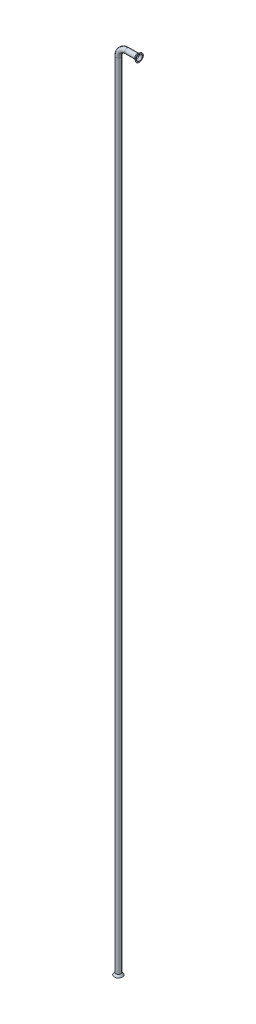
ISO-10303-21;
HEADER;
FILE_DESCRIPTION(('STEP AP214'),'2;1');
FILE_NAME('part.step','',(''),(''),'','','');
FILE_SCHEMA(('AUTOMOTIVE_DESIGN { 1 0 10303 214 1 1 1 1 }'));
ENDSEC;
DATA;
#1=APPLICATION_CONTEXT('core data for automotive mechanical design processes');
#2=APPLICATION_PROTOCOL_DEFINITION('international standard','automotive_design',2000,#1);
#3=PRODUCT_CONTEXT('',#1,'mechanical');
#4=PRODUCT('Part','Part','',(#3));
#5=PRODUCT_RELATED_PRODUCT_CATEGORY('part','',(#4));
#6=PRODUCT_DEFINITION_FORMATION('','',#4);
#7=PRODUCT_DEFINITION_CONTEXT('part definition',#1,'design');
#8=PRODUCT_DEFINITION('design','',#6,#7);
#9=PRODUCT_DEFINITION_SHAPE('','',#8);
#10=(LENGTH_UNIT() NAMED_UNIT(*) SI_UNIT(.MILLI.,.METRE.));
#11=(NAMED_UNIT(*) PLANE_ANGLE_UNIT() SI_UNIT($,.RADIAN.));
#12=(NAMED_UNIT(*) SI_UNIT($,.STERADIAN.) SOLID_ANGLE_UNIT());
#13=UNCERTAINTY_MEASURE_WITH_UNIT(LENGTH_MEASURE(1.E-05),#10,'distance_accuracy_value','');
#14=(GEOMETRIC_REPRESENTATION_CONTEXT(3) GLOBAL_UNCERTAINTY_ASSIGNED_CONTEXT((#13)) GLOBAL_UNIT_ASSIGNED_CONTEXT((#10,
#11,#12)) REPRESENTATION_CONTEXT('',''));
#15=CARTESIAN_POINT('',(0.,0.,0.));
#16=DIRECTION('',(0.,0.,1.));
#17=DIRECTION('',(1.,0.,0.));
#18=AXIS2_PLACEMENT_3D('',#15,#16,#17);
#19=CARTESIAN_POINT('',(0.,0.,0.));
#20=DIRECTION('',(0.,1.,0.));
#21=DIRECTION('',(0.,0.,1.));
#22=AXIS2_PLACEMENT_3D('',#19,#20,#21);
#23=CYLINDRICAL_SURFACE('',#22,3.175);
#24=CARTESIAN_POINT('',(0.,1004.7224,0.));
#25=DIRECTION('',(0.,1.,0.));
#26=DIRECTION('',(0.,0.,1.));
#27=AXIS2_PLACEMENT_3D('',#24,#25,#26);
#28=CIRCLE('',#27,3.175);
#29=CARTESIAN_POINT('',(-3.17500000000006,1004.7224,0.));
#30=VERTEX_POINT('',#29);
#31=EDGE_CURVE('E50',#30,#30,#28,.T.);
#32=ORIENTED_EDGE('',*,*,#31,.F.);
#33=EDGE_LOOP('',(#32));
#34=FACE_BOUND('',#33,.T.);
#35=CARTESIAN_POINT('',(0.,0.,0.));
#36=DIRECTION('',(0.,-1.,0.));
#37=DIRECTION('',(0.,0.,-1.));
#38=AXIS2_PLACEMENT_3D('',#35,#36,#37);
#39=CIRCLE('',#38,3.175);
#40=CARTESIAN_POINT('',(0.,0.,-3.175));
#41=VERTEX_POINT('',#40);
#42=EDGE_CURVE('E57',#41,#41,#39,.T.);
#43=ORIENTED_EDGE('',*,*,#42,.F.);
#44=EDGE_LOOP('',(#43));
#45=FACE_BOUND('',#44,.T.);
#46=ADVANCED_FACE('F32',(#34,#45),#23,.T.);
#47=CARTESIAN_POINT('',(11.2776,1004.7224,0.));
#48=DIRECTION('',(0.,0.,-1.));
#49=DIRECTION('',(-1.,0.,0.));
#50=AXIS2_PLACEMENT_3D('',#47,#48,#49);
#51=TOROIDAL_SURFACE('',#50,11.2776000000001,3.175);
#52=CARTESIAN_POINT('',(11.2776,1016.,0.));
#53=DIRECTION('',(1.,0.,0.));
#54=DIRECTION('',(0.,0.,1.));
#55=AXIS2_PLACEMENT_3D('',#52,#53,#54);
#56=CIRCLE('',#55,3.175);
#57=CARTESIAN_POINT('',(11.2776,1019.175,0.));
#58=VERTEX_POINT('',#57);
#59=EDGE_CURVE('E36',#58,#58,#56,.T.);
#60=CARTESIAN_POINT('',(11.2776,1004.7224,0.));
#61=DIRECTION('',(0.,0.,-1.));
#62=DIRECTION('',(-1.,0.,0.));
#63=AXIS2_PLACEMENT_3D('',#60,#61,#62);
#64=CIRCLE('',#63,14.4526000000001);
#65=EDGE_CURVE('',#30,#58,#64,.T.);
#66=ORIENTED_EDGE('',*,*,#31,.T.);
#67=ORIENTED_EDGE('',*,*,#59,.F.);
#68=ORIENTED_EDGE('',*,*,#65,.T.);
#69=ORIENTED_EDGE('',*,*,#65,.F.);
#70=EDGE_LOOP('',(#66,#68,#67,#69));
#71=FACE_BOUND('',#70,.T.);
#72=ADVANCED_FACE('F98',(#71),#51,.T.);
#73=CARTESIAN_POINT('',(11.2776,1016.,0.));
#74=DIRECTION('',(1.,0.,0.));
#75=DIRECTION('',(0.,0.,-1.));
#76=AXIS2_PLACEMENT_3D('',#73,#74,#75);
#77=CYLINDRICAL_SURFACE('',#76,3.175);
#78=CARTESIAN_POINT('',(23.9776,1016.,0.));
#79=DIRECTION('',(1.,0.,0.));
#80=DIRECTION('',(0.,0.,1.));
#81=AXIS2_PLACEMENT_3D('',#78,#79,#80);
#82=CIRCLE('',#81,3.175);
#83=CARTESIAN_POINT('',(23.9776,1016.,3.175));
#84=VERTEX_POINT('',#83);
#85=EDGE_CURVE('E45',#84,#84,#82,.T.);
#86=ORIENTED_EDGE('',*,*,#85,.F.);
#87=EDGE_LOOP('',(#86));
#88=FACE_BOUND('',#87,.T.);
#89=ORIENTED_EDGE('',*,*,#59,.T.);
#90=EDGE_LOOP('',(#89));
#91=FACE_BOUND('',#90,.T.);
#92=ADVANCED_FACE('F34',(#88,#91),#77,.T.);
#93=CARTESIAN_POINT('',(0.,0.,0.));
#94=DIRECTION('',(0.,1.,0.));
#95=DIRECTION('',(0.,0.,1.));
#96=AXIS2_PLACEMENT_3D('',#93,#94,#95);
#97=CYLINDRICAL_SURFACE('',#96,1.9304);
#98=CARTESIAN_POINT('',(0.,1004.7224,0.));
#99=DIRECTION('',(0.,1.,0.));
#100=DIRECTION('',(0.,0.,1.));
#101=AXIS2_PLACEMENT_3D('',#98,#99,#100);
#102=CIRCLE('',#101,1.9304);
#103=CARTESIAN_POINT('',(-1.93040000000006,1004.7224,0.));
#104=VERTEX_POINT('',#103);
#105=EDGE_CURVE('E40',#104,#104,#102,.F.);
#106=ORIENTED_EDGE('',*,*,#105,.F.);
#107=EDGE_LOOP('',(#106));
#108=FACE_BOUND('',#107,.T.);
#109=CARTESIAN_POINT('',(0.,0.,0.));
#110=DIRECTION('',(0.,-1.,0.));
#111=DIRECTION('',(0.,0.,-1.));
#112=AXIS2_PLACEMENT_3D('',#109,#110,#111);
#113=CIRCLE('',#112,1.9304);
#114=CARTESIAN_POINT('',(0.,0.,-1.9304));
#115=VERTEX_POINT('',#114);
#116=EDGE_CURVE('E61',#115,#115,#113,.T.);
#117=ORIENTED_EDGE('',*,*,#116,.T.);
#118=EDGE_LOOP('',(#117));
#119=FACE_BOUND('',#118,.T.);
#120=ADVANCED_FACE('F97',(#108,#119),#97,.F.);
#121=CARTESIAN_POINT('',(11.2776,1004.7224,0.));
#122=DIRECTION('',(0.,0.,-1.));
#123=DIRECTION('',(-1.,0.,0.));
#124=AXIS2_PLACEMENT_3D('',#121,#122,#123);
#125=TOROIDAL_SURFACE('',#124,11.2776000000001,1.9304);
#126=CARTESIAN_POINT('',(11.2776,1016.,0.));
#127=DIRECTION('',(1.,0.,0.));
#128=DIRECTION('',(0.,0.,1.));
#129=AXIS2_PLACEMENT_3D('',#126,#127,#128);
#130=CIRCLE('',#129,1.9304);
#131=CARTESIAN_POINT('',(11.2776,1017.9304,0.));
#132=VERTEX_POINT('',#131);
#133=EDGE_CURVE('E10',#132,#132,#130,.F.);
#134=CARTESIAN_POINT('',(11.2776,1004.7224,0.));
#135=DIRECTION('',(0.,0.,-1.));
#136=DIRECTION('',(-1.,0.,0.));
#137=AXIS2_PLACEMENT_3D('',#134,#135,#136);
#138=CIRCLE('',#137,13.2080000000001);
#139=EDGE_CURVE('',#104,#132,#138,.T.);
#140=ORIENTED_EDGE('',*,*,#105,.T.);
#141=ORIENTED_EDGE('',*,*,#133,.F.);
#142=ORIENTED_EDGE('',*,*,#139,.T.);
#143=ORIENTED_EDGE('',*,*,#139,.F.);
#144=EDGE_LOOP('',(#140,#142,#141,#143));
#145=FACE_BOUND('',#144,.T.);
#146=ADVANCED_FACE('F110',(#145),#125,.F.);
#147=CARTESIAN_POINT('',(11.2776,1016.,0.));
#148=DIRECTION('',(1.,0.,0.));
#149=DIRECTION('',(0.,0.,-1.));
#150=AXIS2_PLACEMENT_3D('',#147,#148,#149);
#151=CYLINDRICAL_SURFACE('',#150,1.9304);
#152=CARTESIAN_POINT('',(23.9775999999986,1016.,0.));
#153=DIRECTION('',(1.,0.,0.));
#154=DIRECTION('',(0.,1.,0.));
#155=AXIS2_PLACEMENT_3D('',#152,#153,#154);
#156=CIRCLE('',#155,1.93040000000015);
#157=CARTESIAN_POINT('',(23.9775999999986,1017.9304,0.));
#158=VERTEX_POINT('',#157);
#159=EDGE_CURVE('E72',#158,#158,#156,.T.);
#160=ORIENTED_EDGE('',*,*,#159,.T.);
#161=EDGE_LOOP('',(#160));
#162=FACE_BOUND('',#161,.T.);
#163=ORIENTED_EDGE('',*,*,#133,.T.);
#164=EDGE_LOOP('',(#163));
#165=FACE_BOUND('',#164,.T.);
#166=ADVANCED_FACE('F108',(#162,#165),#151,.F.);
#167=CARTESIAN_POINT('',(0.,0.,0.));
#168=DIRECTION('',(0.,-1.,0.));
#169=DIRECTION('',(0.,0.,-1.));
#170=AXIS2_PLACEMENT_3D('',#167,#168,#169);
#171=CONICAL_SURFACE('',#170,3.175,0.645771823237903);
#172=CARTESIAN_POINT('',(0.,-2.54,0.));
#173=DIRECTION('',(0.,-1.,0.));
#174=DIRECTION('',(0.,0.,-1.));
#175=AXIS2_PLACEMENT_3D('',#172,#173,#174);
#176=CIRCLE('',#175,5.0890272872611);
#177=CARTESIAN_POINT('',(0.,-2.54,-5.0890272872611));
#178=VERTEX_POINT('',#177);
#179=EDGE_CURVE('E52',#178,#178,#176,.T.);
#180=ORIENTED_EDGE('',*,*,#179,.F.);
#181=EDGE_LOOP('',(#180));
#182=FACE_BOUND('',#181,.T.);
#183=ORIENTED_EDGE('',*,*,#42,.T.);
#184=EDGE_LOOP('',(#183));
#185=FACE_BOUND('',#184,.T.);
#186=ADVANCED_FACE('F107',(#182,#185),#171,.T.);
#187=CARTESIAN_POINT('',(0.,-2.54,0.));
#188=DIRECTION('',(0.,-1.,0.));
#189=DIRECTION('',(0.,0.,-1.));
#190=AXIS2_PLACEMENT_3D('',#187,#188,#189);
#191=PLANE('',#190);
#192=CARTESIAN_POINT('',(0.,-2.54,0.));
#193=DIRECTION('',(0.,-1.,0.));
#194=DIRECTION('',(0.,0.,-1.));
#195=AXIS2_PLACEMENT_3D('',#192,#193,#194);
#196=CIRCLE('',#195,3.8444272872611);
#197=CARTESIAN_POINT('',(0.,-2.54,-3.8444272872611));
#198=VERTEX_POINT('',#197);
#199=EDGE_CURVE('E66',#198,#198,#196,.T.);
#200=ORIENTED_EDGE('',*,*,#199,.F.);
#201=EDGE_LOOP('',(#200));
#202=FACE_BOUND('',#201,.T.);
#203=ORIENTED_EDGE('',*,*,#179,.T.);
#204=EDGE_LOOP('',(#203));
#205=FACE_BOUND('',#204,.T.);
#206=ADVANCED_FACE('F117',(#202,#205),#191,.T.);
#207=CARTESIAN_POINT('',(0.,-2.54,0.));
#208=DIRECTION('',(0.,-1.,0.));
#209=DIRECTION('',(0.,0.,-1.));
#210=AXIS2_PLACEMENT_3D('',#207,#208,#209);
#211=CONICAL_SURFACE('',#210,3.8444272872611,0.645771823237903);
#212=ORIENTED_EDGE('',*,*,#199,.T.);
#213=EDGE_LOOP('',(#212));
#214=FACE_BOUND('',#213,.T.);
#215=ORIENTED_EDGE('',*,*,#116,.F.);
#216=EDGE_LOOP('',(#215));
#217=FACE_BOUND('',#216,.T.);
#218=ADVANCED_FACE('F91',(#214,#217),#211,.F.);
#219=CARTESIAN_POINT('',(23.9775999999986,1016.,0.));
#220=DIRECTION('',(1.,0.,0.));
#221=DIRECTION('',(0.,1.,0.));
#222=AXIS2_PLACEMENT_3D('',#219,#220,#221);
#223=CONICAL_SURFACE('',#222,3.17500000000003,0.645771823237903);
#224=CARTESIAN_POINT('',(26.5175999999986,1016.,0.));
#225=DIRECTION('',(1.,0.,0.));
#226=DIRECTION('',(0.,1.,0.));
#227=AXIS2_PLACEMENT_3D('',#224,#225,#226);
#228=CIRCLE('',#227,5.08902728726113);
#229=CARTESIAN_POINT('',(26.5175999999986,1021.08902728726,0.));
#230=VERTEX_POINT('',#229);
#231=EDGE_CURVE('E69',#230,#230,#228,.T.);
#232=ORIENTED_EDGE('',*,*,#231,.F.);
#233=EDGE_LOOP('',(#232));
#234=FACE_BOUND('',#233,.T.);
#235=ORIENTED_EDGE('',*,*,#85,.T.);
#236=EDGE_LOOP('',(#235));
#237=FACE_BOUND('',#236,.T.);
#238=ADVANCED_FACE('F85',(#234,#237),#223,.T.);
#239=CARTESIAN_POINT('',(26.5175999999986,1016.,0.));
#240=DIRECTION('',(1.,0.,0.));
#241=DIRECTION('',(0.,1.,0.));
#242=AXIS2_PLACEMENT_3D('',#239,#240,#241);
#243=PLANE('',#242);
#244=CARTESIAN_POINT('',(26.5175999999986,1016.,0.));
#245=DIRECTION('',(1.,0.,0.));
#246=DIRECTION('',(0.,1.,0.));
#247=AXIS2_PLACEMENT_3D('',#244,#245,#246);
#248=CIRCLE('',#247,3.84442728726125);
#249=CARTESIAN_POINT('',(26.5175999999986,1019.84442728726,0.));
#250=VERTEX_POINT('',#249);
#251=EDGE_CURVE('E75',#250,#250,#248,.T.);
#252=ORIENTED_EDGE('',*,*,#251,.F.);
#253=EDGE_LOOP('',(#252));
#254=FACE_BOUND('',#253,.T.);
#255=ORIENTED_EDGE('',*,*,#231,.T.);
#256=EDGE_LOOP('',(#255));
#257=FACE_BOUND('',#256,.T.);
#258=ADVANCED_FACE('F82',(#254,#257),#243,.T.);
#259=CARTESIAN_POINT('',(26.5175999999986,1016.,0.));
#260=DIRECTION('',(1.,0.,0.));
#261=DIRECTION('',(0.,1.,0.));
#262=AXIS2_PLACEMENT_3D('',#259,#260,#261);
#263=CONICAL_SURFACE('',#262,3.84442728726125,0.645771823237903);
#264=ORIENTED_EDGE('',*,*,#251,.T.);
#265=EDGE_LOOP('',(#264));
#266=FACE_BOUND('',#265,.T.);
#267=ORIENTED_EDGE('',*,*,#159,.F.);
#268=EDGE_LOOP('',(#267));
#269=FACE_BOUND('',#268,.T.);
#270=ADVANCED_FACE('F79',(#266,#269),#263,.F.);
#271=CLOSED_SHELL('',(#46,#72,#92,#120,#146,#166,#186,#206,#218,#238,#258,#270));
#272=MANIFOLD_SOLID_BREP('B2',#271);
#273=ADVANCED_BREP_SHAPE_REPRESENTATION('',(#18,#272),#14);
#274=SHAPE_DEFINITION_REPRESENTATION(#9,#273);
ENDSEC;
END-ISO-10303-21;
